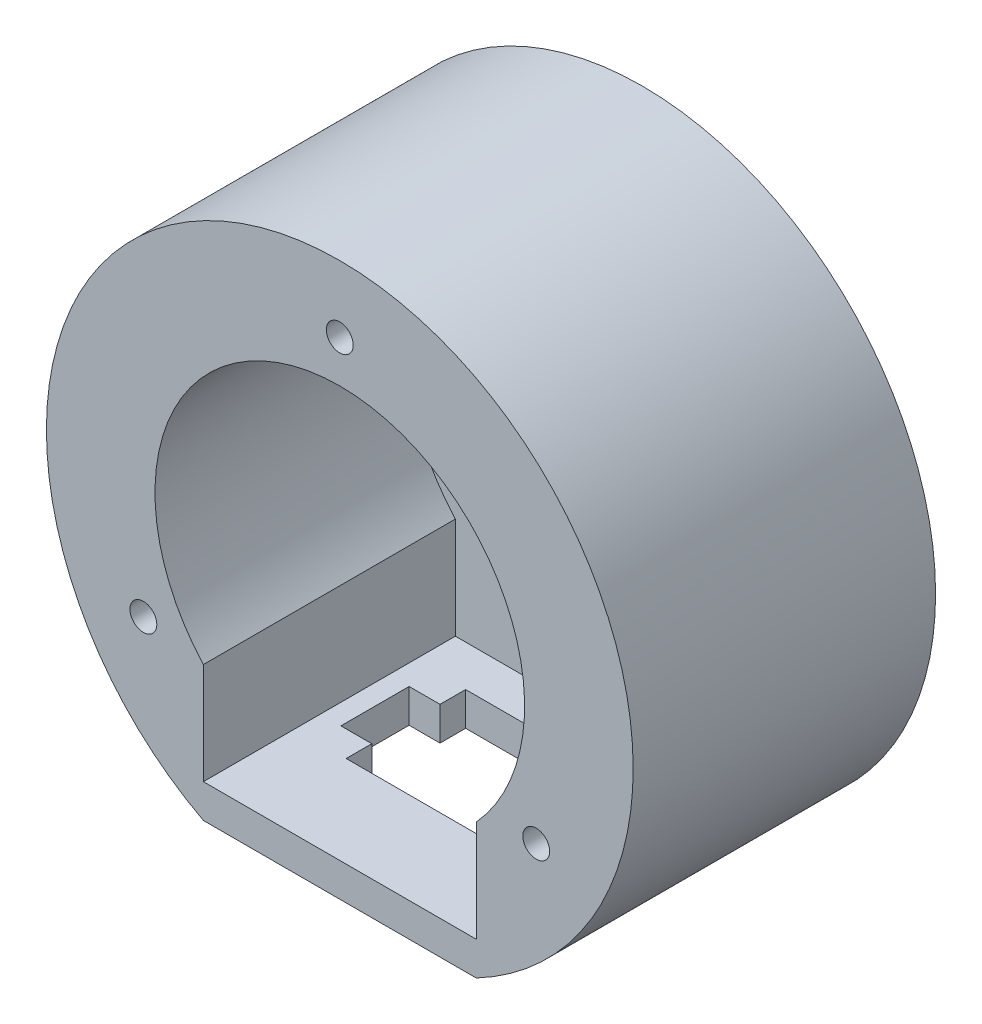
ISO-10303-21;
HEADER;
FILE_DESCRIPTION(('STEP AP214'),'2;1');
FILE_NAME('part.step','',(''),(''),'','','');
FILE_SCHEMA(('AUTOMOTIVE_DESIGN { 1 0 10303 214 1 1 1 1 }'));
ENDSEC;
DATA;
#1=APPLICATION_CONTEXT('core data for automotive mechanical design processes');
#2=APPLICATION_PROTOCOL_DEFINITION('international standard','automotive_design',2000,#1);
#3=PRODUCT_CONTEXT('',#1,'mechanical');
#4=PRODUCT('Part','Part','',(#3));
#5=PRODUCT_RELATED_PRODUCT_CATEGORY('part','',(#4));
#6=PRODUCT_DEFINITION_FORMATION('','',#4);
#7=PRODUCT_DEFINITION_CONTEXT('part definition',#1,'design');
#8=PRODUCT_DEFINITION('design','',#6,#7);
#9=PRODUCT_DEFINITION_SHAPE('','',#8);
#10=(LENGTH_UNIT() NAMED_UNIT(*) SI_UNIT(.MILLI.,.METRE.));
#11=(NAMED_UNIT(*) PLANE_ANGLE_UNIT() SI_UNIT($,.RADIAN.));
#12=(NAMED_UNIT(*) SI_UNIT($,.STERADIAN.) SOLID_ANGLE_UNIT());
#13=UNCERTAINTY_MEASURE_WITH_UNIT(LENGTH_MEASURE(1.E-05),#10,'distance_accuracy_value','');
#14=(GEOMETRIC_REPRESENTATION_CONTEXT(3) GLOBAL_UNCERTAINTY_ASSIGNED_CONTEXT((#13)) GLOBAL_UNIT_ASSIGNED_CONTEXT((#10,
#11,#12)) REPRESENTATION_CONTEXT('',''));
#15=CARTESIAN_POINT('',(0.,0.,0.));
#16=DIRECTION('',(0.,0.,1.));
#17=DIRECTION('',(1.,0.,0.));
#18=AXIS2_PLACEMENT_3D('',#15,#16,#17);
#19=CARTESIAN_POINT('',(0.,0.,18.));
#20=DIRECTION('',(0.,0.,-1.));
#21=DIRECTION('',(-1.,0.,0.));
#22=AXIS2_PLACEMENT_3D('',#19,#20,#21);
#23=CYLINDRICAL_SURFACE('',#22,17.4625);
#24=CARTESIAN_POINT('',(0.,0.,18.));
#25=DIRECTION('',(0.,0.,1.));
#26=DIRECTION('',(1.,0.,0.));
#27=AXIS2_PLACEMENT_3D('',#24,#25,#26);
#28=CIRCLE('',#27,17.4625);
#29=CARTESIAN_POINT('',(8.11956318098455,-15.46,18.));
#30=VERTEX_POINT('',#29);
#31=CARTESIAN_POINT('',(-8.11956318098455,-15.46,18.));
#32=VERTEX_POINT('',#31);
#33=EDGE_CURVE('E394',#30,#32,#28,.T.);
#34=ORIENTED_EDGE('',*,*,#33,.F.);
#35=DIRECTION('',(0.,0.,-1.));
#36=VECTOR('',#35,1.);
#37=CARTESIAN_POINT('',(8.11956318098455,-15.46,18.));
#38=LINE('',#37,#36);
#39=CARTESIAN_POINT('',(8.11956318098455,-15.46,0.));
#40=VERTEX_POINT('',#39);
#41=EDGE_CURVE('E320',#30,#40,#38,.T.);
#42=ORIENTED_EDGE('',*,*,#41,.T.);
#43=CARTESIAN_POINT('',(0.,0.,0.));
#44=DIRECTION('',(0.,0.,1.));
#45=DIRECTION('',(1.,0.,0.));
#46=AXIS2_PLACEMENT_3D('',#43,#44,#45);
#47=CIRCLE('',#46,17.4625);
#48=CARTESIAN_POINT('',(-8.11956318098455,-15.46,0.));
#49=VERTEX_POINT('',#48);
#50=EDGE_CURVE('E379',#40,#49,#47,.T.);
#51=ORIENTED_EDGE('',*,*,#50,.T.);
#52=DIRECTION('',(0.,0.,-1.));
#53=VECTOR('',#52,1.);
#54=CARTESIAN_POINT('',(-8.11956318098455,-15.46,18.));
#55=LINE('',#54,#53);
#56=EDGE_CURVE('E317',#49,#32,#55,.F.);
#57=ORIENTED_EDGE('',*,*,#56,.T.);
#58=EDGE_LOOP('',(#34,#42,#51,#57));
#59=FACE_BOUND('',#58,.T.);
#60=ADVANCED_FACE('F41',(#59),#23,.T.);
#61=CARTESIAN_POINT('',(0.,0.,18.));
#62=DIRECTION('',(0.,0.,1.));
#63=DIRECTION('',(1.,0.,0.));
#64=AXIS2_PLACEMENT_3D('',#61,#62,#63);
#65=PLANE('',#64);
#66=DIRECTION('',(0.,-1.,0.));
#67=VECTOR('',#66,1.);
#68=CARTESIAN_POINT('',(-8.11956318098455,-6.75863679021441,18.));
#69=LINE('',#68,#67);
#70=CARTESIAN_POINT('',(-8.11956318098455,-7.42109788036784,18.));
#71=VERTEX_POINT('',#70);
#72=CARTESIAN_POINT('',(-8.11956318098455,-13.46,18.));
#73=VERTEX_POINT('',#72);
#74=EDGE_CURVE('E189',#71,#73,#69,.T.);
#75=ORIENTED_EDGE('',*,*,#74,.F.);
#76=CARTESIAN_POINT('',(0.,0.,18.));
#77=DIRECTION('',(0.,0.,1.));
#78=DIRECTION('',(1.,0.,0.));
#79=AXIS2_PLACEMENT_3D('',#76,#77,#78);
#80=CIRCLE('',#79,11.);
#81=CARTESIAN_POINT('',(8.13043681901545,-7.4091832972331,18.));
#82=VERTEX_POINT('',#81);
#83=EDGE_CURVE('E327',#82,#71,#80,.T.);
#84=ORIENTED_EDGE('',*,*,#83,.F.);
#85=DIRECTION('',(0.,1.,0.));
#86=VECTOR('',#85,1.);
#87=CARTESIAN_POINT('',(8.13043681901545,-6.75863679021441,18.));
#88=LINE('',#87,#86);
#89=CARTESIAN_POINT('',(8.13043681901545,-13.46,18.));
#90=VERTEX_POINT('',#89);
#91=EDGE_CURVE('E209',#90,#82,#88,.T.);
#92=ORIENTED_EDGE('',*,*,#91,.F.);
#93=DIRECTION('',(1.,0.,0.));
#94=VECTOR('',#93,1.);
#95=CARTESIAN_POINT('',(-8.11956318098455,-13.46,18.));
#96=LINE('',#95,#94);
#97=EDGE_CURVE('E199',#73,#90,#96,.T.);
#98=ORIENTED_EDGE('',*,*,#97,.F.);
#99=EDGE_LOOP('',(#75,#84,#92,#98));
#100=FACE_BOUND('',#99,.T.);
#101=DIRECTION('',(-1.,0.,0.));
#102=VECTOR('',#101,1.);
#103=CARTESIAN_POINT('',(-8.125,-15.46,18.));
#104=LINE('',#103,#102);
#105=EDGE_CURVE('E267',#30,#32,#104,.T.);
#106=ORIENTED_EDGE('',*,*,#105,.F.);
#107=ORIENTED_EDGE('',*,*,#33,.T.);
#108=EDGE_LOOP('',(#106,#107));
#109=FACE_BOUND('',#108,.T.);
#110=CARTESIAN_POINT('',(6.12383107306205E-13,13.5,18.));
#111=DIRECTION('',(0.,0.,1.));
#112=DIRECTION('',(1.,0.,0.));
#113=AXIS2_PLACEMENT_3D('',#110,#111,#112);
#114=CIRCLE('',#113,0.8);
#115=CARTESIAN_POINT('',(0.800000000000613,13.5,18.));
#116=VERTEX_POINT('',#115);
#117=EDGE_CURVE('E380',#116,#116,#114,.T.);
#118=ORIENTED_EDGE('',*,*,#117,.F.);
#119=EDGE_LOOP('',(#118));
#120=FACE_BOUND('',#119,.T.);
#121=CARTESIAN_POINT('',(11.6913429510902,-6.7500000000002,18.));
#122=DIRECTION('',(0.,0.,1.));
#123=DIRECTION('',(1.,0.,0.));
#124=AXIS2_PLACEMENT_3D('',#121,#122,#123);
#125=CIRCLE('',#124,0.800000000000001);
#126=CARTESIAN_POINT('',(12.4913429510902,-6.7500000000002,18.));
#127=VERTEX_POINT('',#126);
#128=EDGE_CURVE('E383',#127,#127,#125,.T.);
#129=ORIENTED_EDGE('',*,*,#128,.F.);
#130=EDGE_LOOP('',(#129));
#131=FACE_BOUND('',#130,.T.);
#132=CARTESIAN_POINT('',(-11.6913429510897,-6.74999999999979,18.));
#133=DIRECTION('',(0.,0.,1.));
#134=DIRECTION('',(1.,0.,0.));
#135=AXIS2_PLACEMENT_3D('',#132,#133,#134);
#136=CIRCLE('',#135,0.800000000000001);
#137=CARTESIAN_POINT('',(-10.8913429510897,-6.74999999999979,18.));
#138=VERTEX_POINT('',#137);
#139=EDGE_CURVE('E389',#138,#138,#136,.T.);
#140=ORIENTED_EDGE('',*,*,#139,.F.);
#141=EDGE_LOOP('',(#140));
#142=FACE_BOUND('',#141,.T.);
#143=ADVANCED_FACE('F211',(#100,#109,#120,#131,#142),#65,.T.);
#144=CARTESIAN_POINT('',(0.,0.,0.));
#145=DIRECTION('',(0.,0.,1.));
#146=DIRECTION('',(1.,0.,0.));
#147=AXIS2_PLACEMENT_3D('',#144,#145,#146);
#148=PLANE('',#147);
#149=ORIENTED_EDGE('',*,*,#50,.F.);
#150=DIRECTION('',(-1.,0.,0.));
#151=VECTOR('',#150,1.);
#152=CARTESIAN_POINT('',(-8.125,-15.46,0.));
#153=LINE('',#152,#151);
#154=EDGE_CURVE('E268',#40,#49,#153,.T.);
#155=ORIENTED_EDGE('',*,*,#154,.T.);
#156=EDGE_LOOP('',(#149,#155));
#157=FACE_BOUND('',#156,.T.);
#158=ADVANCED_FACE('F458',(#157),#148,.F.);
#159=CARTESIAN_POINT('',(-11.6913429510897,-6.74999999999979,8.));
#160=DIRECTION('',(0.,0.,1.));
#161=DIRECTION('',(1.,0.,0.));
#162=AXIS2_PLACEMENT_3D('',#159,#160,#161);
#163=CYLINDRICAL_SURFACE('',#162,0.800000000000001);
#164=CARTESIAN_POINT('',(-11.6913429510897,-6.74999999999979,8.));
#165=DIRECTION('',(0.,0.,1.));
#166=DIRECTION('',(1.,0.,0.));
#167=AXIS2_PLACEMENT_3D('',#164,#165,#166);
#168=CIRCLE('',#167,0.800000000000001);
#169=CARTESIAN_POINT('',(-10.8913429510897,-6.74999999999979,8.));
#170=VERTEX_POINT('',#169);
#171=EDGE_CURVE('E374',#170,#170,#168,.T.);
#172=ORIENTED_EDGE('',*,*,#171,.F.);
#173=EDGE_LOOP('',(#172));
#174=FACE_BOUND('',#173,.T.);
#175=ORIENTED_EDGE('',*,*,#139,.T.);
#176=EDGE_LOOP('',(#175));
#177=FACE_BOUND('',#176,.T.);
#178=ADVANCED_FACE('F466',(#174,#177),#163,.F.);
#179=CARTESIAN_POINT('',(-11.6913429510897,-6.74999999999979,8.));
#180=DIRECTION('',(0.,0.,1.));
#181=DIRECTION('',(1.,0.,0.));
#182=AXIS2_PLACEMENT_3D('',#179,#180,#181);
#183=PLANE('',#182);
#184=ORIENTED_EDGE('',*,*,#171,.T.);
#185=EDGE_LOOP('',(#184));
#186=FACE_BOUND('',#185,.T.);
#187=ADVANCED_FACE('F468',(#186),#183,.T.);
#188=CARTESIAN_POINT('',(11.6913429510902,-6.7500000000002,8.));
#189=DIRECTION('',(0.,0.,1.));
#190=DIRECTION('',(1.,0.,0.));
#191=AXIS2_PLACEMENT_3D('',#188,#189,#190);
#192=CYLINDRICAL_SURFACE('',#191,0.800000000000001);
#193=CARTESIAN_POINT('',(11.6913429510902,-6.7500000000002,8.));
#194=DIRECTION('',(0.,0.,1.));
#195=DIRECTION('',(1.,0.,0.));
#196=AXIS2_PLACEMENT_3D('',#193,#194,#195);
#197=CIRCLE('',#196,0.800000000000001);
#198=CARTESIAN_POINT('',(12.4913429510902,-6.7500000000002,8.));
#199=VERTEX_POINT('',#198);
#200=EDGE_CURVE('E386',#199,#199,#197,.T.);
#201=ORIENTED_EDGE('',*,*,#200,.F.);
#202=EDGE_LOOP('',(#201));
#203=FACE_BOUND('',#202,.T.);
#204=ORIENTED_EDGE('',*,*,#128,.T.);
#205=EDGE_LOOP('',(#204));
#206=FACE_BOUND('',#205,.T.);
#207=ADVANCED_FACE('F475',(#203,#206),#192,.F.);
#208=CARTESIAN_POINT('',(11.6913429510902,-6.7500000000002,8.));
#209=DIRECTION('',(0.,0.,1.));
#210=DIRECTION('',(1.,0.,0.));
#211=AXIS2_PLACEMENT_3D('',#208,#209,#210);
#212=PLANE('',#211);
#213=ORIENTED_EDGE('',*,*,#200,.T.);
#214=EDGE_LOOP('',(#213));
#215=FACE_BOUND('',#214,.T.);
#216=ADVANCED_FACE('F756',(#215),#212,.T.);
#217=CARTESIAN_POINT('',(6.12383107306205E-13,13.5,8.));
#218=DIRECTION('',(0.,0.,1.));
#219=DIRECTION('',(1.,0.,0.));
#220=AXIS2_PLACEMENT_3D('',#217,#218,#219);
#221=CYLINDRICAL_SURFACE('',#220,0.8);
#222=CARTESIAN_POINT('',(6.12383107306205E-13,13.5,8.));
#223=DIRECTION('',(0.,0.,1.));
#224=DIRECTION('',(1.,0.,0.));
#225=AXIS2_PLACEMENT_3D('',#222,#223,#224);
#226=CIRCLE('',#225,0.8);
#227=CARTESIAN_POINT('',(0.800000000000613,13.5,8.));
#228=VERTEX_POINT('',#227);
#229=EDGE_CURVE('E376',#228,#228,#226,.T.);
#230=ORIENTED_EDGE('',*,*,#229,.F.);
#231=EDGE_LOOP('',(#230));
#232=FACE_BOUND('',#231,.T.);
#233=ORIENTED_EDGE('',*,*,#117,.T.);
#234=EDGE_LOOP('',(#233));
#235=FACE_BOUND('',#234,.T.);
#236=ADVANCED_FACE('F747',(#232,#235),#221,.F.);
#237=CARTESIAN_POINT('',(6.12383107306205E-13,13.5,8.));
#238=DIRECTION('',(0.,0.,1.));
#239=DIRECTION('',(1.,0.,0.));
#240=AXIS2_PLACEMENT_3D('',#237,#238,#239);
#241=PLANE('',#240);
#242=ORIENTED_EDGE('',*,*,#229,.T.);
#243=EDGE_LOOP('',(#242));
#244=FACE_BOUND('',#243,.T.);
#245=ADVANCED_FACE('F738',(#244),#241,.T.);
#246=CARTESIAN_POINT('',(0.,0.,3.));
#247=DIRECTION('',(0.,0.,1.));
#248=DIRECTION('',(1.,0.,0.));
#249=AXIS2_PLACEMENT_3D('',#246,#247,#248);
#250=CYLINDRICAL_SURFACE('',#249,11.);
#251=ORIENTED_EDGE('',*,*,#83,.T.);
#252=DIRECTION('',(0.,0.,1.));
#253=VECTOR('',#252,1.);
#254=CARTESIAN_POINT('',(-8.11956318098455,-7.42109788036784,3.));
#255=LINE('',#254,#253);
#256=CARTESIAN_POINT('',(-8.11956318098455,-7.42109788036784,3.));
#257=VERTEX_POINT('',#256);
#258=EDGE_CURVE('E194',#71,#257,#255,.F.);
#259=ORIENTED_EDGE('',*,*,#258,.T.);
#260=CARTESIAN_POINT('',(0.,0.,3.));
#261=DIRECTION('',(0.,0.,1.));
#262=DIRECTION('',(1.,0.,0.));
#263=AXIS2_PLACEMENT_3D('',#260,#261,#262);
#264=CIRCLE('',#263,11.);
#265=CARTESIAN_POINT('',(8.13043681901545,-7.4091832972331,3.));
#266=VERTEX_POINT('',#265);
#267=EDGE_CURVE('E372',#266,#257,#264,.T.);
#268=ORIENTED_EDGE('',*,*,#267,.F.);
#269=DIRECTION('',(0.,0.,1.));
#270=VECTOR('',#269,1.);
#271=CARTESIAN_POINT('',(8.13043681901545,-7.4091832972331,3.));
#272=LINE('',#271,#270);
#273=EDGE_CURVE('E263',#266,#82,#272,.T.);
#274=ORIENTED_EDGE('',*,*,#273,.T.);
#275=EDGE_LOOP('',(#251,#259,#268,#274));
#276=FACE_BOUND('',#275,.T.);
#277=ADVANCED_FACE('F568',(#276),#250,.F.);
#278=CARTESIAN_POINT('',(0.,0.,3.));
#279=DIRECTION('',(0.,0.,1.));
#280=DIRECTION('',(1.,0.,0.));
#281=AXIS2_PLACEMENT_3D('',#278,#279,#280);
#282=PLANE('',#281);
#283=ORIENTED_EDGE('',*,*,#267,.T.);
#284=DIRECTION('',(0.,1.,0.));
#285=VECTOR('',#284,1.);
#286=CARTESIAN_POINT('',(-8.11956318098455,-6.75863679021441,3.));
#287=LINE('',#286,#285);
#288=CARTESIAN_POINT('',(-8.11956318098455,-13.46,3.));
#289=VERTEX_POINT('',#288);
#290=EDGE_CURVE('E219',#289,#257,#287,.T.);
#291=ORIENTED_EDGE('',*,*,#290,.F.);
#292=DIRECTION('',(-1.,0.,0.));
#293=VECTOR('',#292,1.);
#294=CARTESIAN_POINT('',(-8.11956318098455,-13.46,3.));
#295=LINE('',#294,#293);
#296=CARTESIAN_POINT('',(8.13043681901545,-13.46,3.));
#297=VERTEX_POINT('',#296);
#298=EDGE_CURVE('E206',#297,#289,#295,.T.);
#299=ORIENTED_EDGE('',*,*,#298,.F.);
#300=DIRECTION('',(0.,-1.,0.));
#301=VECTOR('',#300,1.);
#302=CARTESIAN_POINT('',(8.13043681901545,-6.75863679021441,3.));
#303=LINE('',#302,#301);
#304=EDGE_CURVE('E55',#266,#297,#303,.T.);
#305=ORIENTED_EDGE('',*,*,#304,.F.);
#306=EDGE_LOOP('',(#283,#291,#299,#305));
#307=FACE_BOUND('',#306,.T.);
#308=ADVANCED_FACE('F562',(#307),#282,.T.);
#309=CARTESIAN_POINT('',(-5.06451579420406,-22.,5.445));
#310=DIRECTION('',(-1.,0.,0.));
#311=DIRECTION('',(0.,0.,1.));
#312=AXIS2_PLACEMENT_3D('',#309,#310,#311);
#313=PLANE('',#312);
#314=DIRECTION('',(0.,1.,0.));
#315=VECTOR('',#314,1.);
#316=CARTESIAN_POINT('',(-5.06451579420406,-22.,5.445));
#317=LINE('',#316,#315);
#318=CARTESIAN_POINT('',(-5.06451579420406,-15.46,5.445));
#319=VERTEX_POINT('',#318);
#320=CARTESIAN_POINT('',(-5.06451579420406,-13.46,5.445));
#321=VERTEX_POINT('',#320);
#322=EDGE_CURVE('E324',#319,#321,#317,.T.);
#323=ORIENTED_EDGE('',*,*,#322,.T.);
#324=DIRECTION('',(0.,0.,1.));
#325=VECTOR('',#324,1.);
#326=CARTESIAN_POINT('',(-5.06451579420406,-13.46,5.445));
#327=LINE('',#326,#325);
#328=CARTESIAN_POINT('',(-5.06451579420406,-13.46,6.97));
#329=VERTEX_POINT('',#328);
#330=EDGE_CURVE('E260',#321,#329,#327,.T.);
#331=ORIENTED_EDGE('',*,*,#330,.T.);
#332=DIRECTION('',(0.,1.,0.));
#333=VECTOR('',#332,1.);
#334=CARTESIAN_POINT('',(-5.06451579420406,-22.,6.97));
#335=LINE('',#334,#333);
#336=CARTESIAN_POINT('',(-5.06451579420406,-15.46,6.97));
#337=VERTEX_POINT('',#336);
#338=EDGE_CURVE('E323',#337,#329,#335,.T.);
#339=ORIENTED_EDGE('',*,*,#338,.F.);
#340=DIRECTION('',(0.,0.,-1.));
#341=VECTOR('',#340,1.);
#342=CARTESIAN_POINT('',(-5.06451579420406,-15.46,5.445));
#343=LINE('',#342,#341);
#344=EDGE_CURVE('E314',#337,#319,#343,.T.);
#345=ORIENTED_EDGE('',*,*,#344,.T.);
#346=EDGE_LOOP('',(#323,#331,#339,#345));
#347=FACE_BOUND('',#346,.T.);
#348=ADVANCED_FACE('F405',(#347),#313,.F.);
#349=CARTESIAN_POINT('',(-5.06451579420406,-22.,5.445));
#350=DIRECTION('',(0.,0.,-1.));
#351=DIRECTION('',(-1.,0.,0.));
#352=AXIS2_PLACEMENT_3D('',#349,#350,#351);
#353=PLANE('',#352);
#354=DIRECTION('',(0.,1.,0.));
#355=VECTOR('',#354,1.);
#356=CARTESIAN_POINT('',(-0.949515794204059,-22.,5.445));
#357=LINE('',#356,#355);
#358=CARTESIAN_POINT('',(-0.949515794204059,-15.46,5.445));
#359=VERTEX_POINT('',#358);
#360=CARTESIAN_POINT('',(-0.949515794204059,-13.46,5.445));
#361=VERTEX_POINT('',#360);
#362=EDGE_CURVE('E328',#359,#361,#357,.T.);
#363=ORIENTED_EDGE('',*,*,#362,.T.);
#364=DIRECTION('',(-1.,0.,0.));
#365=VECTOR('',#364,1.);
#366=CARTESIAN_POINT('',(-5.06451579420406,-13.46,5.445));
#367=LINE('',#366,#365);
#368=EDGE_CURVE('E257',#361,#321,#367,.T.);
#369=ORIENTED_EDGE('',*,*,#368,.T.);
#370=ORIENTED_EDGE('',*,*,#322,.F.);
#371=DIRECTION('',(1.,0.,0.));
#372=VECTOR('',#371,1.);
#373=CARTESIAN_POINT('',(-5.06451579420406,-15.46,5.445));
#374=LINE('',#373,#372);
#375=EDGE_CURVE('E311',#319,#359,#374,.T.);
#376=ORIENTED_EDGE('',*,*,#375,.T.);
#377=EDGE_LOOP('',(#363,#369,#370,#376));
#378=FACE_BOUND('',#377,.T.);
#379=ADVANCED_FACE('F408',(#378),#353,.F.);
#380=CARTESIAN_POINT('',(-0.949515794204058,-22.,3.845));
#381=DIRECTION('',(-1.,0.,0.));
#382=DIRECTION('',(0.,0.,1.));
#383=AXIS2_PLACEMENT_3D('',#380,#381,#382);
#384=PLANE('',#383);
#385=DIRECTION('',(0.,1.,0.));
#386=VECTOR('',#385,1.);
#387=CARTESIAN_POINT('',(-0.949515794204058,-22.,3.845));
#388=LINE('',#387,#386);
#389=CARTESIAN_POINT('',(-0.949515794204058,-15.46,3.845));
#390=VERTEX_POINT('',#389);
#391=CARTESIAN_POINT('',(-0.949515794204058,-13.46,3.845));
#392=VERTEX_POINT('',#391);
#393=EDGE_CURVE('E331',#390,#392,#388,.T.);
#394=ORIENTED_EDGE('',*,*,#393,.T.);
#395=DIRECTION('',(0.,0.,1.));
#396=VECTOR('',#395,1.);
#397=CARTESIAN_POINT('',(-0.949515794204058,-13.46,3.845));
#398=LINE('',#397,#396);
#399=EDGE_CURVE('E254',#392,#361,#398,.T.);
#400=ORIENTED_EDGE('',*,*,#399,.T.);
#401=ORIENTED_EDGE('',*,*,#362,.F.);
#402=DIRECTION('',(0.,0.,-1.));
#403=VECTOR('',#402,1.);
#404=CARTESIAN_POINT('',(-0.949515794204058,-15.46,3.845));
#405=LINE('',#404,#403);
#406=EDGE_CURVE('E308',#359,#390,#405,.T.);
#407=ORIENTED_EDGE('',*,*,#406,.T.);
#408=EDGE_LOOP('',(#394,#400,#401,#407));
#409=FACE_BOUND('',#408,.T.);
#410=ADVANCED_FACE('F411',(#409),#384,.F.);
#411=CARTESIAN_POINT('',(-0.949515794204058,-22.,3.845));
#412=DIRECTION('',(0.,0.,-1.));
#413=DIRECTION('',(-1.,0.,0.));
#414=AXIS2_PLACEMENT_3D('',#411,#412,#413);
#415=PLANE('',#414);
#416=DIRECTION('',(0.,1.,0.));
#417=VECTOR('',#416,1.);
#418=CARTESIAN_POINT('',(1.03048420579594,-22.,3.845));
#419=LINE('',#418,#417);
#420=CARTESIAN_POINT('',(1.03048420579594,-15.46,3.845));
#421=VERTEX_POINT('',#420);
#422=CARTESIAN_POINT('',(1.03048420579594,-13.46,3.845));
#423=VERTEX_POINT('',#422);
#424=EDGE_CURVE('E334',#421,#423,#419,.T.);
#425=ORIENTED_EDGE('',*,*,#424,.T.);
#426=DIRECTION('',(-1.,0.,0.));
#427=VECTOR('',#426,1.);
#428=CARTESIAN_POINT('',(-0.949515794204059,-13.46,3.845));
#429=LINE('',#428,#427);
#430=EDGE_CURVE('E251',#423,#392,#429,.T.);
#431=ORIENTED_EDGE('',*,*,#430,.T.);
#432=ORIENTED_EDGE('',*,*,#393,.F.);
#433=DIRECTION('',(1.,0.,0.));
#434=VECTOR('',#433,1.);
#435=CARTESIAN_POINT('',(-0.949515794204058,-15.46,3.845));
#436=LINE('',#435,#434);
#437=EDGE_CURVE('E305',#390,#421,#436,.T.);
#438=ORIENTED_EDGE('',*,*,#437,.T.);
#439=EDGE_LOOP('',(#425,#431,#432,#438));
#440=FACE_BOUND('',#439,.T.);
#441=ADVANCED_FACE('F414',(#440),#415,.F.);
#442=CARTESIAN_POINT('',(1.03048420579594,-22.,3.845));
#443=DIRECTION('',(1.,0.,0.));
#444=DIRECTION('',(0.,0.,-1.));
#445=AXIS2_PLACEMENT_3D('',#442,#443,#444);
#446=PLANE('',#445);
#447=DIRECTION('',(0.,1.,0.));
#448=VECTOR('',#447,1.);
#449=CARTESIAN_POINT('',(1.03048420579594,-22.,5.445));
#450=LINE('',#449,#448);
#451=CARTESIAN_POINT('',(1.03048420579594,-15.46,5.445));
#452=VERTEX_POINT('',#451);
#453=CARTESIAN_POINT('',(1.03048420579594,-13.46,5.445));
#454=VERTEX_POINT('',#453);
#455=EDGE_CURVE('E337',#452,#454,#450,.T.);
#456=ORIENTED_EDGE('',*,*,#455,.T.);
#457=DIRECTION('',(0.,0.,-1.));
#458=VECTOR('',#457,1.);
#459=CARTESIAN_POINT('',(1.03048420579594,-13.46,3.845));
#460=LINE('',#459,#458);
#461=EDGE_CURVE('E248',#454,#423,#460,.T.);
#462=ORIENTED_EDGE('',*,*,#461,.T.);
#463=ORIENTED_EDGE('',*,*,#424,.F.);
#464=DIRECTION('',(0.,0.,1.));
#465=VECTOR('',#464,1.);
#466=CARTESIAN_POINT('',(1.03048420579594,-15.46,3.845));
#467=LINE('',#466,#465);
#468=EDGE_CURVE('E302',#421,#452,#467,.T.);
#469=ORIENTED_EDGE('',*,*,#468,.T.);
#470=EDGE_LOOP('',(#456,#462,#463,#469));
#471=FACE_BOUND('',#470,.T.);
#472=ADVANCED_FACE('F417',(#471),#446,.F.);
#473=CARTESIAN_POINT('',(1.03048420579594,-22.,5.445));
#474=DIRECTION('',(0.,0.,-1.));
#475=DIRECTION('',(-1.,0.,0.));
#476=AXIS2_PLACEMENT_3D('',#473,#474,#475);
#477=PLANE('',#476);
#478=DIRECTION('',(0.,1.,0.));
#479=VECTOR('',#478,1.);
#480=CARTESIAN_POINT('',(5.14548420579594,-22.,5.445));
#481=LINE('',#480,#479);
#482=CARTESIAN_POINT('',(5.14548420579594,-15.46,5.445));
#483=VERTEX_POINT('',#482);
#484=CARTESIAN_POINT('',(5.14548420579594,-13.46,5.445));
#485=VERTEX_POINT('',#484);
#486=EDGE_CURVE('E340',#483,#485,#481,.T.);
#487=ORIENTED_EDGE('',*,*,#486,.T.);
#488=DIRECTION('',(-1.,0.,0.));
#489=VECTOR('',#488,1.);
#490=CARTESIAN_POINT('',(1.03048420579594,-13.46,5.445));
#491=LINE('',#490,#489);
#492=EDGE_CURVE('E245',#485,#454,#491,.T.);
#493=ORIENTED_EDGE('',*,*,#492,.T.);
#494=ORIENTED_EDGE('',*,*,#455,.F.);
#495=DIRECTION('',(1.,0.,0.));
#496=VECTOR('',#495,1.);
#497=CARTESIAN_POINT('',(1.03048420579594,-15.46,5.445));
#498=LINE('',#497,#496);
#499=EDGE_CURVE('E299',#452,#483,#498,.T.);
#500=ORIENTED_EDGE('',*,*,#499,.T.);
#501=EDGE_LOOP('',(#487,#493,#494,#500));
#502=FACE_BOUND('',#501,.T.);
#503=ADVANCED_FACE('F420',(#502),#477,.F.);
#504=CARTESIAN_POINT('',(5.14548420579594,-22.,5.445));
#505=DIRECTION('',(1.,0.,0.));
#506=DIRECTION('',(0.,0.,-1.));
#507=AXIS2_PLACEMENT_3D('',#504,#505,#506);
#508=PLANE('',#507);
#509=DIRECTION('',(0.,1.,0.));
#510=VECTOR('',#509,1.);
#511=CARTESIAN_POINT('',(5.14548420579594,-22.,6.97));
#512=LINE('',#511,#510);
#513=CARTESIAN_POINT('',(5.14548420579594,-15.46,6.97));
#514=VERTEX_POINT('',#513);
#515=CARTESIAN_POINT('',(5.14548420579594,-13.46,6.97));
#516=VERTEX_POINT('',#515);
#517=EDGE_CURVE('E343',#514,#516,#512,.T.);
#518=ORIENTED_EDGE('',*,*,#517,.T.);
#519=DIRECTION('',(0.,0.,-1.));
#520=VECTOR('',#519,1.);
#521=CARTESIAN_POINT('',(5.14548420579594,-13.46,5.445));
#522=LINE('',#521,#520);
#523=EDGE_CURVE('E242',#516,#485,#522,.T.);
#524=ORIENTED_EDGE('',*,*,#523,.T.);
#525=ORIENTED_EDGE('',*,*,#486,.F.);
#526=DIRECTION('',(0.,0.,1.));
#527=VECTOR('',#526,1.);
#528=CARTESIAN_POINT('',(5.14548420579594,-15.46,5.445));
#529=LINE('',#528,#527);
#530=EDGE_CURVE('E296',#483,#514,#529,.T.);
#531=ORIENTED_EDGE('',*,*,#530,.T.);
#532=EDGE_LOOP('',(#518,#524,#525,#531));
#533=FACE_BOUND('',#532,.T.);
#534=ADVANCED_FACE('F423',(#533),#508,.F.);
#535=CARTESIAN_POINT('',(5.14548420579594,-22.,6.97));
#536=DIRECTION('',(0.,0.,-1.));
#537=DIRECTION('',(-1.,0.,0.));
#538=AXIS2_PLACEMENT_3D('',#535,#536,#537);
#539=PLANE('',#538);
#540=DIRECTION('',(0.,1.,0.));
#541=VECTOR('',#540,1.);
#542=CARTESIAN_POINT('',(6.98548420579594,-22.,6.97));
#543=LINE('',#542,#541);
#544=CARTESIAN_POINT('',(6.98548420579594,-15.46,6.97));
#545=VERTEX_POINT('',#544);
#546=CARTESIAN_POINT('',(6.98548420579594,-13.46,6.97));
#547=VERTEX_POINT('',#546);
#548=EDGE_CURVE('E346',#545,#547,#543,.T.);
#549=ORIENTED_EDGE('',*,*,#548,.T.);
#550=DIRECTION('',(-1.,0.,0.));
#551=VECTOR('',#550,1.);
#552=CARTESIAN_POINT('',(5.14548420579594,-13.46,6.97));
#553=LINE('',#552,#551);
#554=EDGE_CURVE('E239',#547,#516,#553,.T.);
#555=ORIENTED_EDGE('',*,*,#554,.T.);
#556=ORIENTED_EDGE('',*,*,#517,.F.);
#557=DIRECTION('',(1.,0.,0.));
#558=VECTOR('',#557,1.);
#559=CARTESIAN_POINT('',(5.14548420579594,-15.46,6.97));
#560=LINE('',#559,#558);
#561=EDGE_CURVE('E293',#514,#545,#560,.T.);
#562=ORIENTED_EDGE('',*,*,#561,.T.);
#563=EDGE_LOOP('',(#549,#555,#556,#562));
#564=FACE_BOUND('',#563,.T.);
#565=ADVANCED_FACE('F426',(#564),#539,.F.);
#566=CARTESIAN_POINT('',(6.98548420579594,-22.,6.97));
#567=DIRECTION('',(1.,0.,0.));
#568=DIRECTION('',(0.,0.,-1.));
#569=AXIS2_PLACEMENT_3D('',#566,#567,#568);
#570=PLANE('',#569);
#571=DIRECTION('',(0.,1.,0.));
#572=VECTOR('',#571,1.);
#573=CARTESIAN_POINT('',(6.98548420579594,-22.,11.03));
#574=LINE('',#573,#572);
#575=CARTESIAN_POINT('',(6.98548420579594,-15.46,11.03));
#576=VERTEX_POINT('',#575);
#577=CARTESIAN_POINT('',(6.98548420579594,-13.46,11.03));
#578=VERTEX_POINT('',#577);
#579=EDGE_CURVE('E349',#576,#578,#574,.T.);
#580=ORIENTED_EDGE('',*,*,#579,.T.);
#581=DIRECTION('',(0.,0.,-1.));
#582=VECTOR('',#581,1.);
#583=CARTESIAN_POINT('',(6.98548420579594,-13.46,6.97));
#584=LINE('',#583,#582);
#585=EDGE_CURVE('E236',#578,#547,#584,.T.);
#586=ORIENTED_EDGE('',*,*,#585,.T.);
#587=ORIENTED_EDGE('',*,*,#548,.F.);
#588=DIRECTION('',(0.,0.,1.));
#589=VECTOR('',#588,1.);
#590=CARTESIAN_POINT('',(6.98548420579594,-15.46,6.97));
#591=LINE('',#590,#589);
#592=EDGE_CURVE('E290',#545,#576,#591,.T.);
#593=ORIENTED_EDGE('',*,*,#592,.T.);
#594=EDGE_LOOP('',(#580,#586,#587,#593));
#595=FACE_BOUND('',#594,.T.);
#596=ADVANCED_FACE('F429',(#595),#570,.F.);
#597=CARTESIAN_POINT('',(5.14548420579594,-22.,11.03));
#598=DIRECTION('',(0.,0.,1.));
#599=DIRECTION('',(1.,0.,0.));
#600=AXIS2_PLACEMENT_3D('',#597,#598,#599);
#601=PLANE('',#600);
#602=DIRECTION('',(0.,1.,0.));
#603=VECTOR('',#602,1.);
#604=CARTESIAN_POINT('',(5.14548420579594,-22.,11.03));
#605=LINE('',#604,#603);
#606=CARTESIAN_POINT('',(5.14548420579594,-15.46,11.03));
#607=VERTEX_POINT('',#606);
#608=CARTESIAN_POINT('',(5.14548420579594,-13.46,11.03));
#609=VERTEX_POINT('',#608);
#610=EDGE_CURVE('E352',#607,#609,#605,.T.);
#611=ORIENTED_EDGE('',*,*,#610,.T.);
#612=DIRECTION('',(1.,0.,0.));
#613=VECTOR('',#612,1.);
#614=CARTESIAN_POINT('',(5.14548420579594,-13.46,11.03));
#615=LINE('',#614,#613);
#616=EDGE_CURVE('E233',#609,#578,#615,.T.);
#617=ORIENTED_EDGE('',*,*,#616,.T.);
#618=ORIENTED_EDGE('',*,*,#579,.F.);
#619=DIRECTION('',(-1.,0.,0.));
#620=VECTOR('',#619,1.);
#621=CARTESIAN_POINT('',(5.14548420579594,-15.46,11.03));
#622=LINE('',#621,#620);
#623=EDGE_CURVE('E287',#576,#607,#622,.T.);
#624=ORIENTED_EDGE('',*,*,#623,.T.);
#625=EDGE_LOOP('',(#611,#617,#618,#624));
#626=FACE_BOUND('',#625,.T.);
#627=ADVANCED_FACE('F432',(#626),#601,.F.);
#628=CARTESIAN_POINT('',(5.14548420579594,-22.,12.555));
#629=DIRECTION('',(1.,0.,0.));
#630=DIRECTION('',(0.,0.,-1.));
#631=AXIS2_PLACEMENT_3D('',#628,#629,#630);
#632=PLANE('',#631);
#633=DIRECTION('',(0.,1.,0.));
#634=VECTOR('',#633,1.);
#635=CARTESIAN_POINT('',(5.14548420579594,-22.,12.555));
#636=LINE('',#635,#634);
#637=CARTESIAN_POINT('',(5.14548420579594,-15.46,12.555));
#638=VERTEX_POINT('',#637);
#639=CARTESIAN_POINT('',(5.14548420579594,-13.46,12.555));
#640=VERTEX_POINT('',#639);
#641=EDGE_CURVE('E355',#638,#640,#636,.T.);
#642=ORIENTED_EDGE('',*,*,#641,.T.);
#643=DIRECTION('',(0.,0.,-1.));
#644=VECTOR('',#643,1.);
#645=CARTESIAN_POINT('',(5.14548420579594,-13.46,12.555));
#646=LINE('',#645,#644);
#647=EDGE_CURVE('E230',#640,#609,#646,.T.);
#648=ORIENTED_EDGE('',*,*,#647,.T.);
#649=ORIENTED_EDGE('',*,*,#610,.F.);
#650=DIRECTION('',(0.,0.,1.));
#651=VECTOR('',#650,1.);
#652=CARTESIAN_POINT('',(5.14548420579594,-15.46,12.555));
#653=LINE('',#652,#651);
#654=EDGE_CURVE('E284',#607,#638,#653,.T.);
#655=ORIENTED_EDGE('',*,*,#654,.T.);
#656=EDGE_LOOP('',(#642,#648,#649,#655));
#657=FACE_BOUND('',#656,.T.);
#658=ADVANCED_FACE('F435',(#657),#632,.F.);
#659=CARTESIAN_POINT('',(-5.06451579420406,-22.,12.555));
#660=DIRECTION('',(0.,0.,1.));
#661=DIRECTION('',(1.,0.,0.));
#662=AXIS2_PLACEMENT_3D('',#659,#660,#661);
#663=PLANE('',#662);
#664=DIRECTION('',(0.,1.,0.));
#665=VECTOR('',#664,1.);
#666=CARTESIAN_POINT('',(-5.06451579420406,-22.,12.555));
#667=LINE('',#666,#665);
#668=CARTESIAN_POINT('',(-5.06451579420406,-15.46,12.555));
#669=VERTEX_POINT('',#668);
#670=CARTESIAN_POINT('',(-5.06451579420406,-13.46,12.555));
#671=VERTEX_POINT('',#670);
#672=EDGE_CURVE('E358',#669,#671,#667,.T.);
#673=ORIENTED_EDGE('',*,*,#672,.T.);
#674=DIRECTION('',(1.,0.,0.));
#675=VECTOR('',#674,1.);
#676=CARTESIAN_POINT('',(-5.06451579420406,-13.46,12.555));
#677=LINE('',#676,#675);
#678=EDGE_CURVE('E227',#671,#640,#677,.T.);
#679=ORIENTED_EDGE('',*,*,#678,.T.);
#680=ORIENTED_EDGE('',*,*,#641,.F.);
#681=DIRECTION('',(-1.,0.,0.));
#682=VECTOR('',#681,1.);
#683=CARTESIAN_POINT('',(-5.06451579420406,-15.46,12.555));
#684=LINE('',#683,#682);
#685=EDGE_CURVE('E281',#638,#669,#684,.T.);
#686=ORIENTED_EDGE('',*,*,#685,.T.);
#687=EDGE_LOOP('',(#673,#679,#680,#686));
#688=FACE_BOUND('',#687,.T.);
#689=ADVANCED_FACE('F438',(#688),#663,.F.);
#690=CARTESIAN_POINT('',(-5.06451579420406,-22.,12.555));
#691=DIRECTION('',(-1.,0.,0.));
#692=DIRECTION('',(0.,0.,1.));
#693=AXIS2_PLACEMENT_3D('',#690,#691,#692);
#694=PLANE('',#693);
#695=DIRECTION('',(0.,1.,0.));
#696=VECTOR('',#695,1.);
#697=CARTESIAN_POINT('',(-5.06451579420406,-22.,11.03));
#698=LINE('',#697,#696);
#699=CARTESIAN_POINT('',(-5.06451579420406,-15.46,11.03));
#700=VERTEX_POINT('',#699);
#701=CARTESIAN_POINT('',(-5.06451579420406,-13.46,11.03));
#702=VERTEX_POINT('',#701);
#703=EDGE_CURVE('E361',#700,#702,#698,.T.);
#704=ORIENTED_EDGE('',*,*,#703,.T.);
#705=DIRECTION('',(0.,0.,1.));
#706=VECTOR('',#705,1.);
#707=CARTESIAN_POINT('',(-5.06451579420406,-13.46,12.555));
#708=LINE('',#707,#706);
#709=EDGE_CURVE('E224',#702,#671,#708,.T.);
#710=ORIENTED_EDGE('',*,*,#709,.T.);
#711=ORIENTED_EDGE('',*,*,#672,.F.);
#712=DIRECTION('',(0.,0.,-1.));
#713=VECTOR('',#712,1.);
#714=CARTESIAN_POINT('',(-5.06451579420406,-15.46,12.555));
#715=LINE('',#714,#713);
#716=EDGE_CURVE('E278',#669,#700,#715,.T.);
#717=ORIENTED_EDGE('',*,*,#716,.T.);
#718=EDGE_LOOP('',(#704,#710,#711,#717));
#719=FACE_BOUND('',#718,.T.);
#720=ADVANCED_FACE('F441',(#719),#694,.F.);
#721=CARTESIAN_POINT('',(-6.90451579420406,-22.,11.03));
#722=DIRECTION('',(0.,0.,1.));
#723=DIRECTION('',(1.,0.,0.));
#724=AXIS2_PLACEMENT_3D('',#721,#722,#723);
#725=PLANE('',#724);
#726=DIRECTION('',(0.,1.,0.));
#727=VECTOR('',#726,1.);
#728=CARTESIAN_POINT('',(-6.90451579420406,-22.,11.03));
#729=LINE('',#728,#727);
#730=CARTESIAN_POINT('',(-6.90451579420406,-15.46,11.03));
#731=VERTEX_POINT('',#730);
#732=CARTESIAN_POINT('',(-6.90451579420406,-13.46,11.03));
#733=VERTEX_POINT('',#732);
#734=EDGE_CURVE('E364',#731,#733,#729,.T.);
#735=ORIENTED_EDGE('',*,*,#734,.T.);
#736=DIRECTION('',(1.,0.,0.));
#737=VECTOR('',#736,1.);
#738=CARTESIAN_POINT('',(-6.90451579420406,-13.46,11.03));
#739=LINE('',#738,#737);
#740=EDGE_CURVE('E221',#733,#702,#739,.T.);
#741=ORIENTED_EDGE('',*,*,#740,.T.);
#742=ORIENTED_EDGE('',*,*,#703,.F.);
#743=DIRECTION('',(-1.,0.,0.));
#744=VECTOR('',#743,1.);
#745=CARTESIAN_POINT('',(-6.90451579420406,-15.46,11.03));
#746=LINE('',#745,#744);
#747=EDGE_CURVE('E275',#700,#731,#746,.T.);
#748=ORIENTED_EDGE('',*,*,#747,.T.);
#749=EDGE_LOOP('',(#735,#741,#742,#748));
#750=FACE_BOUND('',#749,.T.);
#751=ADVANCED_FACE('F444',(#750),#725,.F.);
#752=CARTESIAN_POINT('',(-6.90451579420406,-22.,6.97));
#753=DIRECTION('',(-1.,0.,0.));
#754=DIRECTION('',(0.,0.,1.));
#755=AXIS2_PLACEMENT_3D('',#752,#753,#754);
#756=PLANE('',#755);
#757=DIRECTION('',(0.,1.,0.));
#758=VECTOR('',#757,1.);
#759=CARTESIAN_POINT('',(-6.90451579420406,-22.,6.97));
#760=LINE('',#759,#758);
#761=CARTESIAN_POINT('',(-6.90451579420406,-15.46,6.97));
#762=VERTEX_POINT('',#761);
#763=CARTESIAN_POINT('',(-6.90451579420406,-13.46,6.97));
#764=VERTEX_POINT('',#763);
#765=EDGE_CURVE('E367',#762,#764,#760,.T.);
#766=ORIENTED_EDGE('',*,*,#765,.T.);
#767=DIRECTION('',(0.,0.,1.));
#768=VECTOR('',#767,1.);
#769=CARTESIAN_POINT('',(-6.90451579420406,-13.46,6.97));
#770=LINE('',#769,#768);
#771=EDGE_CURVE('E63',#764,#733,#770,.T.);
#772=ORIENTED_EDGE('',*,*,#771,.T.);
#773=ORIENTED_EDGE('',*,*,#734,.F.);
#774=DIRECTION('',(0.,0.,-1.));
#775=VECTOR('',#774,1.);
#776=CARTESIAN_POINT('',(-6.90451579420406,-15.46,6.97));
#777=LINE('',#776,#775);
#778=EDGE_CURVE('E271',#731,#762,#777,.T.);
#779=ORIENTED_EDGE('',*,*,#778,.T.);
#780=EDGE_LOOP('',(#766,#772,#773,#779));
#781=FACE_BOUND('',#780,.T.);
#782=ADVANCED_FACE('F447',(#781),#756,.F.);
#783=CARTESIAN_POINT('',(-6.90451579420406,-22.,6.97));
#784=DIRECTION('',(0.,0.,-1.));
#785=DIRECTION('',(-1.,0.,0.));
#786=AXIS2_PLACEMENT_3D('',#783,#784,#785);
#787=PLANE('',#786);
#788=ORIENTED_EDGE('',*,*,#338,.T.);
#789=DIRECTION('',(-1.,0.,0.));
#790=VECTOR('',#789,1.);
#791=CARTESIAN_POINT('',(-6.90451579420406,-13.46,6.97));
#792=LINE('',#791,#790);
#793=EDGE_CURVE('E11',#329,#764,#792,.T.);
#794=ORIENTED_EDGE('',*,*,#793,.T.);
#795=ORIENTED_EDGE('',*,*,#765,.F.);
#796=DIRECTION('',(1.,0.,0.));
#797=VECTOR('',#796,1.);
#798=CARTESIAN_POINT('',(-6.90451579420406,-15.46,6.97));
#799=LINE('',#798,#797);
#800=EDGE_CURVE('E48',#762,#337,#799,.T.);
#801=ORIENTED_EDGE('',*,*,#800,.T.);
#802=EDGE_LOOP('',(#788,#794,#795,#801));
#803=FACE_BOUND('',#802,.T.);
#804=ADVANCED_FACE('F402',(#803),#787,.F.);
#805=CARTESIAN_POINT('',(-8.125,-15.46,0.));
#806=DIRECTION('',(0.,1.,0.));
#807=DIRECTION('',(0.,0.,1.));
#808=AXIS2_PLACEMENT_3D('',#805,#806,#807);
#809=PLANE('',#808);
#810=ORIENTED_EDGE('',*,*,#800,.F.);
#811=ORIENTED_EDGE('',*,*,#778,.F.);
#812=ORIENTED_EDGE('',*,*,#747,.F.);
#813=ORIENTED_EDGE('',*,*,#716,.F.);
#814=ORIENTED_EDGE('',*,*,#685,.F.);
#815=ORIENTED_EDGE('',*,*,#654,.F.);
#816=ORIENTED_EDGE('',*,*,#623,.F.);
#817=ORIENTED_EDGE('',*,*,#592,.F.);
#818=ORIENTED_EDGE('',*,*,#561,.F.);
#819=ORIENTED_EDGE('',*,*,#530,.F.);
#820=ORIENTED_EDGE('',*,*,#499,.F.);
#821=ORIENTED_EDGE('',*,*,#468,.F.);
#822=ORIENTED_EDGE('',*,*,#437,.F.);
#823=ORIENTED_EDGE('',*,*,#406,.F.);
#824=ORIENTED_EDGE('',*,*,#375,.F.);
#825=ORIENTED_EDGE('',*,*,#344,.F.);
#826=EDGE_LOOP('',(#810,#811,#812,#813,#814,#815,#816,#817,#818,#819,#820,#821,#822,#823,#824,#825));
#827=FACE_BOUND('',#826,.T.);
#828=ORIENTED_EDGE('',*,*,#105,.T.);
#829=ORIENTED_EDGE('',*,*,#56,.F.);
#830=ORIENTED_EDGE('',*,*,#154,.F.);
#831=ORIENTED_EDGE('',*,*,#41,.F.);
#832=EDGE_LOOP('',(#828,#829,#830,#831));
#833=FACE_BOUND('',#832,.T.);
#834=ADVANCED_FACE('F448',(#827,#833),#809,.F.);
#835=CARTESIAN_POINT('',(-8.11956318098455,-6.75863679021441,-14.5775643611243));
#836=DIRECTION('',(-1.,0.,0.));
#837=DIRECTION('',(0.,-1.,0.));
#838=AXIS2_PLACEMENT_3D('',#835,#836,#837);
#839=PLANE('',#838);
#840=ORIENTED_EDGE('',*,*,#74,.T.);
#841=DIRECTION('',(0.,0.,1.));
#842=VECTOR('',#841,1.);
#843=CARTESIAN_POINT('',(-8.11956318098455,-13.46,-14.5775643611243));
#844=LINE('',#843,#842);
#845=EDGE_CURVE('E192',#289,#73,#844,.T.);
#846=ORIENTED_EDGE('',*,*,#845,.F.);
#847=ORIENTED_EDGE('',*,*,#290,.T.);
#848=ORIENTED_EDGE('',*,*,#258,.F.);
#849=EDGE_LOOP('',(#840,#846,#847,#848));
#850=FACE_BOUND('',#849,.T.);
#851=ADVANCED_FACE('F191',(#850),#839,.F.);
#852=CARTESIAN_POINT('',(8.13043681901545,-6.75863679021441,-14.5775643611243));
#853=DIRECTION('',(1.,0.,0.));
#854=DIRECTION('',(0.,1.,0.));
#855=AXIS2_PLACEMENT_3D('',#852,#853,#854);
#856=PLANE('',#855);
#857=ORIENTED_EDGE('',*,*,#304,.T.);
#858=DIRECTION('',(0.,0.,1.));
#859=VECTOR('',#858,1.);
#860=CARTESIAN_POINT('',(8.13043681901545,-13.46,-14.5775643611243));
#861=LINE('',#860,#859);
#862=EDGE_CURVE('E208',#297,#90,#861,.T.);
#863=ORIENTED_EDGE('',*,*,#862,.T.);
#864=ORIENTED_EDGE('',*,*,#91,.T.);
#865=ORIENTED_EDGE('',*,*,#273,.F.);
#866=EDGE_LOOP('',(#857,#863,#864,#865));
#867=FACE_BOUND('',#866,.T.);
#868=ADVANCED_FACE('F534',(#867),#856,.F.);
#869=CARTESIAN_POINT('',(-8.11956318098455,-13.46,-14.5775643611243));
#870=DIRECTION('',(0.,-1.,0.));
#871=DIRECTION('',(1.,0.,0.));
#872=AXIS2_PLACEMENT_3D('',#869,#870,#871);
#873=PLANE('',#872);
#874=ORIENTED_EDGE('',*,*,#298,.T.);
#875=ORIENTED_EDGE('',*,*,#845,.T.);
#876=ORIENTED_EDGE('',*,*,#97,.T.);
#877=ORIENTED_EDGE('',*,*,#862,.F.);
#878=EDGE_LOOP('',(#874,#875,#876,#877));
#879=FACE_BOUND('',#878,.T.);
#880=ORIENTED_EDGE('',*,*,#368,.F.);
#881=ORIENTED_EDGE('',*,*,#399,.F.);
#882=ORIENTED_EDGE('',*,*,#430,.F.);
#883=ORIENTED_EDGE('',*,*,#461,.F.);
#884=ORIENTED_EDGE('',*,*,#492,.F.);
#885=ORIENTED_EDGE('',*,*,#523,.F.);
#886=ORIENTED_EDGE('',*,*,#554,.F.);
#887=ORIENTED_EDGE('',*,*,#585,.F.);
#888=ORIENTED_EDGE('',*,*,#616,.F.);
#889=ORIENTED_EDGE('',*,*,#647,.F.);
#890=ORIENTED_EDGE('',*,*,#678,.F.);
#891=ORIENTED_EDGE('',*,*,#709,.F.);
#892=ORIENTED_EDGE('',*,*,#740,.F.);
#893=ORIENTED_EDGE('',*,*,#771,.F.);
#894=ORIENTED_EDGE('',*,*,#793,.F.);
#895=ORIENTED_EDGE('',*,*,#330,.F.);
#896=EDGE_LOOP('',(#880,#881,#882,#883,#884,#885,#886,#887,#888,#889,#890,#891,#892,#893,#894,#895));
#897=FACE_BOUND('',#896,.T.);
#898=ADVANCED_FACE('F203',(#879,#897),#873,.F.);
#899=CLOSED_SHELL('',(#60,#143,#158,#178,#187,#207,#216,#236,#245,#277,#308,#348,#379,#410,#441,
#472,#503,#534,#565,#596,#627,#658,#689,#720,#751,#782,#804,#834,#851,#868,#898));
#900=MANIFOLD_SOLID_BREP('B2',#899);
#901=ADVANCED_BREP_SHAPE_REPRESENTATION('',(#18,#900),#14);
#902=SHAPE_DEFINITION_REPRESENTATION(#9,#901);
ENDSEC;
END-ISO-10303-21;
